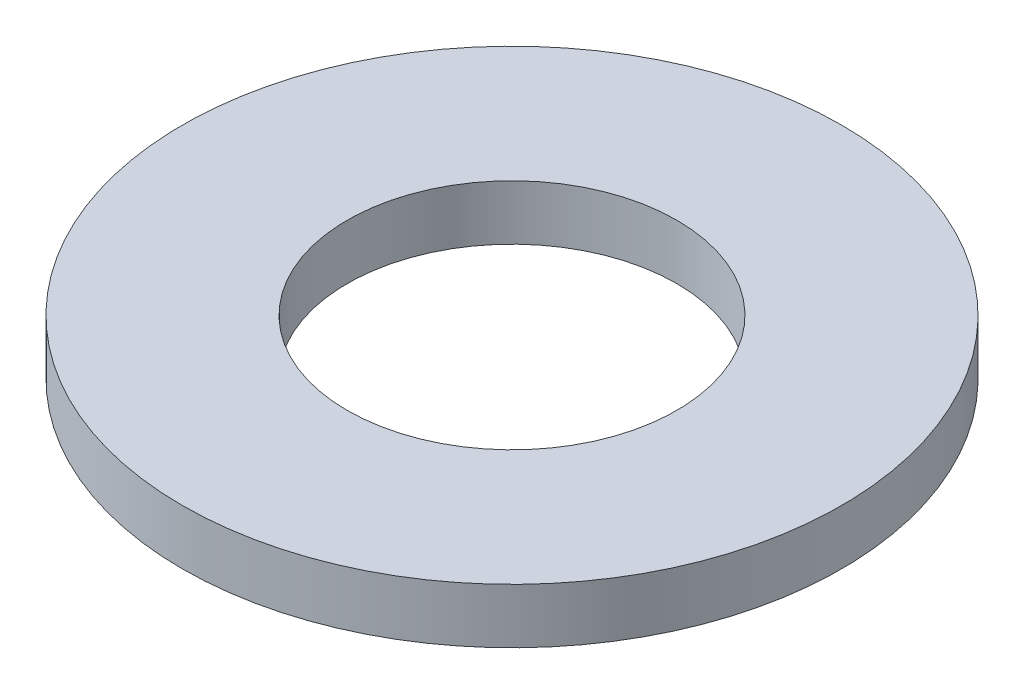
ISO-10303-21;
HEADER;
FILE_DESCRIPTION(('STEP AP214'),'2;1');
FILE_NAME('part.step','',(''),(''),'','','');
FILE_SCHEMA(('AUTOMOTIVE_DESIGN { 1 0 10303 214 1 1 1 1 }'));
ENDSEC;
DATA;
#1=APPLICATION_CONTEXT('core data for automotive mechanical design processes');
#2=APPLICATION_PROTOCOL_DEFINITION('international standard','automotive_design',2000,#1);
#3=PRODUCT_CONTEXT('',#1,'mechanical');
#4=PRODUCT('Part','Part','',(#3));
#5=PRODUCT_RELATED_PRODUCT_CATEGORY('part','',(#4));
#6=PRODUCT_DEFINITION_FORMATION('','',#4);
#7=PRODUCT_DEFINITION_CONTEXT('part definition',#1,'design');
#8=PRODUCT_DEFINITION('design','',#6,#7);
#9=PRODUCT_DEFINITION_SHAPE('','',#8);
#10=(LENGTH_UNIT() NAMED_UNIT(*) SI_UNIT(.MILLI.,.METRE.));
#11=(NAMED_UNIT(*) PLANE_ANGLE_UNIT() SI_UNIT($,.RADIAN.));
#12=(NAMED_UNIT(*) SI_UNIT($,.STERADIAN.) SOLID_ANGLE_UNIT());
#13=UNCERTAINTY_MEASURE_WITH_UNIT(LENGTH_MEASURE(1.E-05),#10,'distance_accuracy_value','');
#14=(GEOMETRIC_REPRESENTATION_CONTEXT(3) GLOBAL_UNCERTAINTY_ASSIGNED_CONTEXT((#13)) GLOBAL_UNIT_ASSIGNED_CONTEXT((#10,
#11,#12)) REPRESENTATION_CONTEXT('',''));
#15=CARTESIAN_POINT('',(0.,0.,0.));
#16=DIRECTION('',(0.,0.,1.));
#17=DIRECTION('',(1.,0.,0.));
#18=AXIS2_PLACEMENT_3D('',#15,#16,#17);
#19=CARTESIAN_POINT('',(0.,3.175,0.));
#20=DIRECTION('',(0.,1.,0.));
#21=DIRECTION('',(0.,0.,1.));
#22=AXIS2_PLACEMENT_3D('',#19,#20,#21);
#23=PLANE('',#22);
#24=CARTESIAN_POINT('',(0.,3.175,0.));
#25=DIRECTION('',(0.,1.,0.));
#26=DIRECTION('',(0.,0.,1.));
#27=AXIS2_PLACEMENT_3D('',#24,#25,#26);
#28=CIRCLE('',#27,19.05);
#29=CARTESIAN_POINT('',(0.,3.175,19.05));
#30=VERTEX_POINT('',#29);
#31=EDGE_CURVE('E10',#30,#30,#28,.T.);
#32=ORIENTED_EDGE('',*,*,#31,.T.);
#33=EDGE_LOOP('',(#32));
#34=FACE_BOUND('',#33,.T.);
#35=CARTESIAN_POINT('',(0.,3.175,0.));
#36=DIRECTION('',(0.,1.,0.));
#37=DIRECTION('',(0.,0.,1.));
#38=AXIS2_PLACEMENT_3D('',#35,#36,#37);
#39=CIRCLE('',#38,9.525);
#40=CARTESIAN_POINT('',(0.,3.175,9.525));
#41=VERTEX_POINT('',#40);
#42=EDGE_CURVE('E39',#41,#41,#39,.T.);
#43=ORIENTED_EDGE('',*,*,#42,.F.);
#44=EDGE_LOOP('',(#43));
#45=FACE_BOUND('',#44,.T.);
#46=ADVANCED_FACE('F28',(#34,#45),#23,.T.);
#47=CARTESIAN_POINT('',(0.,0.,0.));
#48=DIRECTION('',(0.,1.,0.));
#49=DIRECTION('',(0.,0.,1.));
#50=AXIS2_PLACEMENT_3D('',#47,#48,#49);
#51=PLANE('',#50);
#52=CARTESIAN_POINT('',(0.,0.,0.));
#53=DIRECTION('',(0.,1.,0.));
#54=DIRECTION('',(0.,0.,1.));
#55=AXIS2_PLACEMENT_3D('',#52,#53,#54);
#56=CIRCLE('',#55,19.05);
#57=CARTESIAN_POINT('',(0.,0.,19.05));
#58=VERTEX_POINT('',#57);
#59=EDGE_CURVE('E32',#58,#58,#56,.T.);
#60=ORIENTED_EDGE('',*,*,#59,.F.);
#61=EDGE_LOOP('',(#60));
#62=FACE_BOUND('',#61,.T.);
#63=CARTESIAN_POINT('',(0.,0.,0.));
#64=DIRECTION('',(0.,1.,0.));
#65=DIRECTION('',(0.,0.,1.));
#66=AXIS2_PLACEMENT_3D('',#63,#64,#65);
#67=CIRCLE('',#66,9.525);
#68=CARTESIAN_POINT('',(0.,0.,9.525));
#69=VERTEX_POINT('',#68);
#70=EDGE_CURVE('E41',#69,#69,#67,.T.);
#71=ORIENTED_EDGE('',*,*,#70,.T.);
#72=EDGE_LOOP('',(#71));
#73=FACE_BOUND('',#72,.T.);
#74=ADVANCED_FACE('F51',(#62,#73),#51,.F.);
#75=CARTESIAN_POINT('',(0.,3.175,0.));
#76=DIRECTION('',(0.,-1.,0.));
#77=DIRECTION('',(0.,0.,-1.));
#78=AXIS2_PLACEMENT_3D('',#75,#76,#77);
#79=CYLINDRICAL_SURFACE('',#78,19.05);
#80=ORIENTED_EDGE('',*,*,#31,.F.);
#81=EDGE_LOOP('',(#80));
#82=FACE_BOUND('',#81,.T.);
#83=ORIENTED_EDGE('',*,*,#59,.T.);
#84=EDGE_LOOP('',(#83));
#85=FACE_BOUND('',#84,.T.);
#86=ADVANCED_FACE('F30',(#82,#85),#79,.T.);
#87=CARTESIAN_POINT('',(0.,3.175,0.));
#88=DIRECTION('',(0.,-1.,0.));
#89=DIRECTION('',(0.,0.,-1.));
#90=AXIS2_PLACEMENT_3D('',#87,#88,#89);
#91=CYLINDRICAL_SURFACE('',#90,9.525);
#92=ORIENTED_EDGE('',*,*,#42,.T.);
#93=EDGE_LOOP('',(#92));
#94=FACE_BOUND('',#93,.T.);
#95=ORIENTED_EDGE('',*,*,#70,.F.);
#96=EDGE_LOOP('',(#95));
#97=FACE_BOUND('',#96,.T.);
#98=ADVANCED_FACE('F47',(#94,#97),#91,.F.);
#99=CLOSED_SHELL('',(#46,#74,#86,#98));
#100=MANIFOLD_SOLID_BREP('B2',#99);
#101=ADVANCED_BREP_SHAPE_REPRESENTATION('',(#18,#100),#14);
#102=SHAPE_DEFINITION_REPRESENTATION(#9,#101);
ENDSEC;
END-ISO-10303-21;
